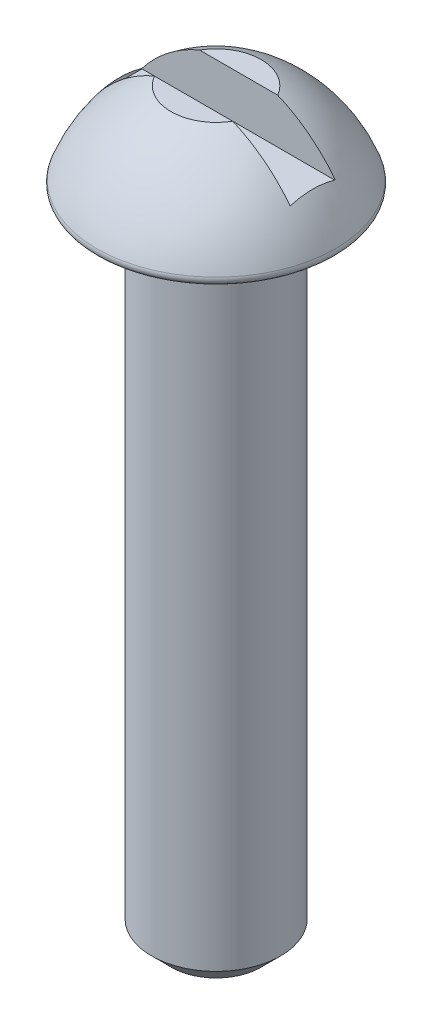
ISO-10303-21;
HEADER;
FILE_DESCRIPTION(('STEP AP214'),'2;1');
FILE_NAME('part.step','',(''),(''),'','','');
FILE_SCHEMA(('AUTOMOTIVE_DESIGN { 1 0 10303 214 1 1 1 1 }'));
ENDSEC;
DATA;
#1=APPLICATION_CONTEXT('core data for automotive mechanical design processes');
#2=APPLICATION_PROTOCOL_DEFINITION('international standard','automotive_design',2000,#1);
#3=PRODUCT_CONTEXT('',#1,'mechanical');
#4=PRODUCT('Part','Part','',(#3));
#5=PRODUCT_RELATED_PRODUCT_CATEGORY('part','',(#4));
#6=PRODUCT_DEFINITION_FORMATION('','',#4);
#7=PRODUCT_DEFINITION_CONTEXT('part definition',#1,'design');
#8=PRODUCT_DEFINITION('design','',#6,#7);
#9=PRODUCT_DEFINITION_SHAPE('','',#8);
#10=(LENGTH_UNIT() NAMED_UNIT(*) SI_UNIT(.MILLI.,.METRE.));
#11=(NAMED_UNIT(*) PLANE_ANGLE_UNIT() SI_UNIT($,.RADIAN.));
#12=(NAMED_UNIT(*) SI_UNIT($,.STERADIAN.) SOLID_ANGLE_UNIT());
#13=UNCERTAINTY_MEASURE_WITH_UNIT(LENGTH_MEASURE(1.E-05),#10,'distance_accuracy_value','');
#14=(GEOMETRIC_REPRESENTATION_CONTEXT(3) GLOBAL_UNCERTAINTY_ASSIGNED_CONTEXT((#13)) GLOBAL_UNIT_ASSIGNED_CONTEXT((#10,
#11,#12)) REPRESENTATION_CONTEXT('',''));
#15=CARTESIAN_POINT('',(0.,0.,0.));
#16=DIRECTION('',(0.,0.,1.));
#17=DIRECTION('',(1.,0.,0.));
#18=AXIS2_PLACEMENT_3D('',#15,#16,#17);
#19=CARTESIAN_POINT('',(0.,11.5,0.));
#20=DIRECTION('',(0.,1.,0.));
#21=DIRECTION('',(0.,0.,1.));
#22=AXIS2_PLACEMENT_3D('',#19,#20,#21);
#23=PLANE('',#22);
#24=DIRECTION('',(-1.,0.,0.));
#25=VECTOR('',#24,1.);
#26=CARTESIAN_POINT('',(-1.5,11.5,-0.35));
#27=LINE('',#26,#25);
#28=CARTESIAN_POINT('',(0.606217782649107,11.5,-0.35));
#29=VERTEX_POINT('',#28);
#30=CARTESIAN_POINT('',(-0.606217782649107,11.5,-0.35));
#31=VERTEX_POINT('',#30);
#32=EDGE_CURVE('E105',#29,#31,#27,.T.);
#33=ORIENTED_EDGE('',*,*,#32,.F.);
#34=CARTESIAN_POINT('',(0.,11.5,0.));
#35=DIRECTION('',(0.,-1.,0.));
#36=DIRECTION('',(0.,0.,-1.));
#37=AXIS2_PLACEMENT_3D('',#34,#35,#36);
#38=CIRCLE('',#37,0.7);
#39=EDGE_CURVE('E128',#31,#29,#38,.T.);
#40=ORIENTED_EDGE('',*,*,#39,.F.);
#41=EDGE_LOOP('',(#33,#40));
#42=FACE_BOUND('',#41,.T.);
#43=ADVANCED_FACE('F29',(#42),#23,.T.);
#44=CARTESIAN_POINT('',(0.7,0.,0.));
#45=DIRECTION('',(0.,-1.,0.));
#46=DIRECTION('',(0.,0.,-1.));
#47=AXIS2_PLACEMENT_3D('',#44,#45,#46);
#48=PLANE('',#47);
#49=CARTESIAN_POINT('',(0.,0.,0.));
#50=DIRECTION('',(0.,-1.,0.));
#51=DIRECTION('',(0.,0.,-1.));
#52=AXIS2_PLACEMENT_3D('',#49,#50,#51);
#53=CIRCLE('',#52,0.7);
#54=CARTESIAN_POINT('',(0.,0.,-0.7));
#55=VERTEX_POINT('',#54);
#56=EDGE_CURVE('E115',#55,#55,#53,.T.);
#57=ORIENTED_EDGE('',*,*,#56,.T.);
#58=EDGE_LOOP('',(#57));
#59=FACE_BOUND('',#58,.T.);
#60=ADVANCED_FACE('F31',(#59),#48,.T.);
#61=DIRECTION('',(1.,0.,0.));
#62=VECTOR('',#61,1.);
#63=CARTESIAN_POINT('',(-1.5,11.5,0.35));
#64=LINE('',#63,#62);
#65=CARTESIAN_POINT('',(-0.606217782649107,11.5,0.35));
#66=VERTEX_POINT('',#65);
#67=CARTESIAN_POINT('',(0.606217782649107,11.5,0.35));
#68=VERTEX_POINT('',#67);
#69=EDGE_CURVE('E107',#66,#68,#64,.T.);
#70=ORIENTED_EDGE('',*,*,#69,.F.);
#71=EDGE_CURVE('E131',#68,#66,#38,.T.);
#72=ORIENTED_EDGE('',*,*,#71,.F.);
#73=EDGE_LOOP('',(#70,#72));
#74=FACE_BOUND('',#73,.T.);
#75=ADVANCED_FACE('F176',(#74),#23,.T.);
#76=CARTESIAN_POINT('',(0.,9.42256290284434,0.));
#77=DIRECTION('',(0.,-1.,0.));
#78=DIRECTION('',(0.,0.,-1.));
#79=AXIS2_PLACEMENT_3D('',#76,#77,#78);
#80=DEGENERATE_TOROIDAL_SURFACE('',#79,0.30700994668161,2.30863897683338,.F.);
#81=CARTESIAN_POINT('',(0.,11.6357397722598,-0.35));
#82=CARTESIAN_POINT('',(-0.0301024352128601,11.6357409907999,-0.35));
#83=CARTESIAN_POINT('',(-0.0602037065858999,11.6345773745603,-0.35));
#84=CARTESIAN_POINT('',(-0.120237464629894,11.6300447670969,-0.35));
#85=CARTESIAN_POINT('',(-0.15016992368712,11.6266754250504,-0.35));
#86=CARTESIAN_POINT('',(-0.239755636779077,11.6136400395453,-0.35));
#87=CARTESIAN_POINT('',(-0.298988945429481,11.6010498286245,-0.35));
#88=CARTESIAN_POINT('',(-0.4107220201702,11.5712488314893,-0.35));
#89=CARTESIAN_POINT('',(-0.463360105723818,11.5545337272663,-0.35));
#90=CARTESIAN_POINT('',(-0.567078580438325,11.5167776839069,-0.35));
#91=CARTESIAN_POINT('',(-0.618158166080245,11.4957345552367,-0.35));
#92=CARTESIAN_POINT('',(-0.768700695331826,11.4266891236243,-0.35));
#93=CARTESIAN_POINT('',(-0.865504105738005,11.3727604560737,-0.35));
#94=CARTESIAN_POINT('',(-1.05381770511512,11.2485525807219,-0.35));
#95=CARTESIAN_POINT('',(-1.14493451427674,11.1776815134193,-0.35));
#96=CARTESIAN_POINT('',(-1.31520585423532,11.0228692332829,-0.35));
#97=CARTESIAN_POINT('',(-1.39436581290115,10.9389339863448,-0.35));
#98=CARTESIAN_POINT('',(-1.5458587899203,10.7515038643497,-0.35));
#99=CARTESIAN_POINT('',(-1.61683638715699,10.6469096000385,-0.35));
#100=CARTESIAN_POINT('',(-1.74048477136378,10.4273513028306,-0.35));
#101=CARTESIAN_POINT('',(-1.79314587012967,10.312381822504,-0.35));
#102=CARTESIAN_POINT('',(-1.87917651162118,10.0739543970035,-0.35));
#103=CARTESIAN_POINT('',(-1.91232042380521,9.95041495071043,-0.35));
#104=CARTESIAN_POINT('',(-1.95744743808432,9.69955872286589,-0.35));
#105=CARTESIAN_POINT('',(-1.9694348144659,9.57224270958615,-0.35));
#106=CARTESIAN_POINT('',(-1.97193309925212,9.31708719715163,-0.35));
#107=CARTESIAN_POINT('',(-1.96239143952019,9.1892471791102,-0.35));
#108=CARTESIAN_POINT('',(-1.92197991496443,8.93692504523293,-0.35));
#109=CARTESIAN_POINT('',(-1.89110056432445,8.8124444484343,-0.35));
#110=CARTESIAN_POINT('',(-1.80884392511569,8.57036655976084,-0.35));
#111=CARTESIAN_POINT('',(-1.75745428138543,8.45277346588935,-0.35));
#112=CARTESIAN_POINT('',(-1.63569213592404,8.22806771696485,-0.35));
#113=CARTESIAN_POINT('',(-1.56534615403697,8.12094070305138,-0.35));
#114=CARTESIAN_POINT('',(-1.40788549136369,7.92042796844041,-0.35));
#115=CARTESIAN_POINT('',(-1.32082850128929,7.82699686840395,-0.35));
#116=CARTESIAN_POINT('',(-1.13169955336796,7.65579882780108,-0.35));
#117=CARTESIAN_POINT('',(-1.02956695382156,7.57809830586138,-0.35));
#118=CARTESIAN_POINT('',(-0.867954840857823,7.47596834442508,-0.35));
#119=CARTESIAN_POINT('',(-0.812867875261867,7.44440520962073,-0.35));
#120=CARTESIAN_POINT('',(-0.700072885190367,7.38623855042426,-0.35));
#121=CARTESIAN_POINT('',(-0.642363567822304,7.35963750621012,-0.35));
#122=CARTESIAN_POINT('',(-0.525137072964047,7.31206247407257,-0.35));
#123=CARTESIAN_POINT('',(-0.465635245674406,7.29105066689571,-0.35));
#124=CARTESIAN_POINT('',(-0.34479697692258,7.25519828705325,-0.35));
#125=CARTESIAN_POINT('',(-0.283462170275168,7.24035238137611,-0.35));
#126=CARTESIAN_POINT('',(-0.182837497701832,7.22267504478291,-0.35));
#127=CARTESIAN_POINT('',(-0.143975000741484,7.21742349587871,-0.35));
#128=CARTESIAN_POINT('',(-0.0659472153998695,7.21060851468356,-0.35));
#129=CARTESIAN_POINT('',(-0.0267822634587782,7.209041449989,-0.35));
#130=CARTESIAN_POINT('',(0.0514996994513464,7.20986014915738,-0.35));
#131=CARTESIAN_POINT('',(0.0906167147447707,7.21224552543082,-0.35));
#132=CARTESIAN_POINT('',(0.168489516968755,7.22057120365083,-0.35));
#133=CARTESIAN_POINT('',(0.207244913460363,7.22651497794714,-0.35));
#134=CARTESIAN_POINT('',(0.297186983275777,7.24385667146756,-0.35));
#135=CARTESIAN_POINT('',(0.348147444927706,7.25641909406697,-0.35));
#136=CARTESIAN_POINT('',(0.448782130756163,7.28585305100436,-0.35));
#137=CARTESIAN_POINT('',(0.49845610619327,7.30272541190968,-0.35));
#138=CARTESIAN_POINT('',(0.645691735122621,7.35920364103099,-0.35));
#139=CARTESIAN_POINT('',(0.741086931735451,7.40458897505198,-0.35));
#140=CARTESIAN_POINT('',(0.926914711477642,7.51006939168425,-0.35));
#141=CARTESIAN_POINT('',(1.01712639940075,7.57054913552739,-0.35));
#142=CARTESIAN_POINT('',(1.18761541773933,7.70377154084975,-0.35));
#143=CARTESIAN_POINT('',(1.26791683452433,7.7764834130205,-0.35));
#144=CARTESIAN_POINT('',(1.42898606712891,7.94492874445312,-0.35));
#145=CARTESIAN_POINT('',(1.50785880157877,8.04248421849531,-0.35));
#146=CARTESIAN_POINT('',(1.64853351430612,8.24939447232945,-0.35));
#147=CARTESIAN_POINT('',(1.71031058090735,8.35876615151073,-0.35));
#148=CARTESIAN_POINT('',(1.81587916059814,8.58809092488977,-0.35));
#149=CARTESIAN_POINT('',(1.85935475794216,8.70818964733825,-0.35));
#150=CARTESIAN_POINT('',(1.92559076522618,8.9539162328496,-0.35));
#151=CARTESIAN_POINT('',(1.94835898429007,9.07954199281432,-0.35));
#152=CARTESIAN_POINT('',(1.97262656380435,9.33332204735554,-0.35));
#153=CARTESIAN_POINT('',(1.97404368969976,9.46148421557371,-0.35));
#154=CARTESIAN_POINT('',(1.95535530532741,9.71625193900725,-0.35));
#155=CARTESIAN_POINT('',(1.9352459718645,9.84285721367133,-0.35));
#156=CARTESIAN_POINT('',(1.8740414996424,10.0909743417433,-0.35));
#157=CARTESIAN_POINT('',(1.83293334362505,10.2124829851089,-0.35));
#158=CARTESIAN_POINT('',(1.73088669666713,10.4468326497111,-0.35));
#159=CARTESIAN_POINT('',(1.66995287582174,10.5596757044672,-0.35));
#160=CARTESIAN_POINT('',(1.53005046998842,10.7733326174854,-0.35));
#161=CARTESIAN_POINT('',(1.45110918047703,10.8741643338103,-0.35));
#162=CARTESIAN_POINT('',(1.27729409761748,11.0610985455507,-0.35));
#163=CARTESIAN_POINT('',(1.18241077455345,11.1471921684167,-0.35));
#164=CARTESIAN_POINT('',(0.979876940738835,11.3015005372263,-0.35));
#165=CARTESIAN_POINT('',(0.872308436433898,11.3698218606841,-0.35));
#166=CARTESIAN_POINT('',(0.703337919829301,11.4573215356916,-0.35));
#167=CARTESIAN_POINT('',(0.645714301815417,11.4840005557108,-0.35));
#168=CARTESIAN_POINT('',(0.528241861947788,11.5319241605888,-0.35));
#169=CARTESIAN_POINT('',(0.468394366795809,11.5531719278043,-0.35));
#170=CARTESIAN_POINT('',(0.374465982094129,11.5811684898228,-0.35));
#171=CARTESIAN_POINT('',(0.341030799034514,11.5901189334694,-0.35));
#172=CARTESIAN_POINT('',(0.273662343838696,11.6059109291983,-0.35));
#173=CARTESIAN_POINT('',(0.23972914719522,11.6127527975251,-0.35));
#174=CARTESIAN_POINT('',(0.171615827365621,11.6239521890918,-0.35));
#175=CARTESIAN_POINT('',(0.137437694740273,11.6283215785176,-0.35));
#176=CARTESIAN_POINT('',(0.068839138506105,11.6342141511404,-0.35));
#177=CARTESIAN_POINT('',(0.0344188084861335,11.6357383789939,-0.35));
#178=CARTESIAN_POINT('',(0.,11.6357397722598,-0.35));
#179=B_SPLINE_CURVE_WITH_KNOTS('',3,(#81,#82,#83,#84,#85,#86,#87,#88,#89,#90,#91,#92,#93,#94,
#95,#96,#97,#98,#99,#100,#101,#102,#103,#104,#105,#106,#107,#108,#109,#110,#111,#112,#113,#114,
#115,#116,#117,#118,#119,#120,#121,#122,#123,#124,#125,#126,#127,#128,#129,#130,#131,#132,#133,
#134,#135,#136,#137,#138,#139,#140,#141,#142,#143,#144,#145,#146,#147,#148,#149,#150,#151,#152,
#153,#154,#155,#156,#157,#158,#159,#160,#161,#162,#163,#164,#165,#166,#167,#168,#169,#170,#171,
#172,#173,#174,#175,#176,#177,#178),.UNSPECIFIED.,.T.,.F.,(4,2,2,2,2,2,2,2,2,2,2,2,2,2,2,2,2,2,
2,2,2,2,2,2,2,2,2,2,2,2,2,2,2,2,2,2,2,2,2,2,2,2,2,2,2,2,2,2,4),(0.,0.0902833208739151,
0.180581004879809,0.361796063276472,0.527288087985619,0.692864041427401,1.02390289255829,
1.36885285309954,1.71364574828677,2.0910746667025,2.46870291729688,2.85061517384456,
3.23245026325272,3.61521870029256,3.99815740922052,4.38132714497277,4.76396358598733,
5.14530208186301,5.52821856826565,5.71848612033824,5.90884851959201,6.09788804105489,
6.28676371623324,6.40427084256284,6.5216620740792,6.63904179450269,6.75653624332486,
6.91374732931968,7.07098858819111,7.38662454837917,7.71131599850878,8.0352020769111,
8.40979352951631,8.78492799356518,9.16629591030332,9.54751994664993,9.93021190828653,
10.3129718490002,10.6959693526722,11.0788767034316,11.4612074604209,11.8437675828505,
12.2239777193922,12.4142717245481,12.6044539730276,12.708238810703,12.812008075123,
12.9152750005792,13.0185040021094),.UNSPECIFIED.);
#180=CARTESIAN_POINT('',(1.5,10.8072248752532,-0.35));
#181=VERTEX_POINT('',#180);
#182=EDGE_CURVE('E11',#181,#29,#179,.T.);
#183=ORIENTED_EDGE('',*,*,#182,.F.);
#184=CARTESIAN_POINT('',(1.5,10.859409790285,0.));
#185=CARTESIAN_POINT('',(1.5,10.859401175273,-0.0789068754106214));
#186=CARTESIAN_POINT('',(1.5,10.8515155932438,-0.157939355680735));
#187=CARTESIAN_POINT('',(1.5,10.8204761977011,-0.313038755257548));
#188=CARTESIAN_POINT('',(1.5,10.7972888784922,-0.389098777871058));
#189=CARTESIAN_POINT('',(1.5,10.7412685980686,-0.525400075486102));
#190=CARTESIAN_POINT('',(1.5,10.7102017645297,-0.586377951264507));
#191=CARTESIAN_POINT('',(1.5,10.6390362707288,-0.702733899656246));
#192=CARTESIAN_POINT('',(1.5,10.5989435520028,-0.758115621500189));
#193=CARTESIAN_POINT('',(1.5,10.5074121561563,-0.866522430703715));
#194=CARTESIAN_POINT('',(1.5,10.455317444329,-0.918993130106391));
#195=CARTESIAN_POINT('',(1.5,10.3436355443957,-1.01525351273952));
#196=CARTESIAN_POINT('',(1.5,10.2840445327647,-1.0590387363215));
#197=CARTESIAN_POINT('',(1.5,10.1539021441734,-1.14030196999279));
#198=CARTESIAN_POINT('',(1.5,10.0828543819259,-1.17698613895365));
#199=CARTESIAN_POINT('',(1.5,9.93583340388057,-1.23859568647142));
#200=CARTESIAN_POINT('',(1.5,9.85985891849232,-1.26351802025982));
#201=CARTESIAN_POINT('',(1.5,9.70081830526798,-1.30213580286138));
#202=CARTESIAN_POINT('',(1.5,9.61758981678659,-1.31516501550607));
#203=CARTESIAN_POINT('',(1.5,9.45011896880228,-1.3273951363592));
#204=CARTESIAN_POINT('',(1.5,9.36587645289109,-1.32659388325657));
#205=CARTESIAN_POINT('',(1.5,9.19682801634196,-1.31100598337756));
#206=CARTESIAN_POINT('',(1.5,9.11204997514758,-1.29591427001923));
#207=CARTESIAN_POINT('',(1.5,8.94625150305734,-1.25161746552035));
#208=CARTESIAN_POINT('',(1.5,8.86523125169323,-1.22241170082808));
#209=CARTESIAN_POINT('',(1.5,8.70995516153703,-1.150774844073));
#210=CARTESIAN_POINT('',(1.5,8.63565492875653,-1.10844022107787));
#211=CARTESIAN_POINT('',(1.5,8.49558375099919,-1.01140940009124));
#212=CARTESIAN_POINT('',(1.5,8.42981224200647,-0.956714020189879));
#213=CARTESIAN_POINT('',(1.5,8.31167933387313,-0.838692716318822));
#214=CARTESIAN_POINT('',(1.5,8.25888683590651,-0.775799413158824));
#215=CARTESIAN_POINT('',(1.5,8.16566156087609,-0.641422049268792));
#216=CARTESIAN_POINT('',(1.5,8.12522165984964,-0.569942973374794));
#217=CARTESIAN_POINT('',(1.5,8.06138813678361,-0.426353683253212));
#218=CARTESIAN_POINT('',(1.5,8.03691319574603,-0.354725107969685));
#219=CARTESIAN_POINT('',(1.5,8.00162295621348,-0.208191871208454));
#220=CARTESIAN_POINT('',(1.5,7.99079712574264,-0.133289781886585));
#221=CARTESIAN_POINT('',(1.5,7.98377588161359,0.0107388735101599));
#222=CARTESIAN_POINT('',(1.5,7.98640653657512,0.0798104971340135));
#223=CARTESIAN_POINT('',(1.5,8.00347672130369,0.216470996634306));
#224=CARTESIAN_POINT('',(1.5,8.01791568636424,0.284059943257802));
#225=CARTESIAN_POINT('',(1.5,8.05749241124266,0.414640873488694));
#226=CARTESIAN_POINT('',(1.5,8.08242841962748,0.477694559269938));
#227=CARTESIAN_POINT('',(1.5,8.14190646463359,0.599082826856921));
#228=CARTESIAN_POINT('',(1.5,8.17645064857673,0.657416349991642));
#229=CARTESIAN_POINT('',(1.5,8.25641623215448,0.77173089633452));
#230=CARTESIAN_POINT('',(1.5,8.30239121683484,0.827324040488962));
#231=CARTESIAN_POINT('',(1.5,8.40235044439788,0.930760533294298));
#232=CARTESIAN_POINT('',(1.5,8.45633736099184,0.978601283653914));
#233=CARTESIAN_POINT('',(1.5,8.57570828307641,1.06939508415863));
#234=CARTESIAN_POINT('',(1.5,8.64167076459879,1.11158832366889));
#235=CARTESIAN_POINT('',(1.5,8.7794148818912,1.18506079377902));
#236=CARTESIAN_POINT('',(1.5,8.85119826886297,1.21633672481574));
#237=CARTESIAN_POINT('',(1.5,9.00335258097233,1.26899663114905));
#238=CARTESIAN_POINT('',(1.5,9.08397986859716,1.28964184313034));
#239=CARTESIAN_POINT('',(1.5,9.24752120906563,1.31755133411357));
#240=CARTESIAN_POINT('',(1.5,9.33043571747581,1.32481292755937));
#241=CARTESIAN_POINT('',(1.5,9.49890222534467,1.32582180677956));
#242=CARTESIAN_POINT('',(1.5,9.58445709214885,1.31914760109607));
#243=CARTESIAN_POINT('',(1.5,9.75324879008596,1.29156086022552));
#244=CARTESIAN_POINT('',(1.5,9.83648545543133,1.27064730941109));
#245=CARTESIAN_POINT('',(1.5,9.99834081092673,1.21498289879362));
#246=CARTESIAN_POINT('',(1.5,10.076952841605,1.18021261924573));
#247=CARTESIAN_POINT('',(1.5,10.2269934004609,1.0975858409938));
#248=CARTESIAN_POINT('',(1.5,10.2984223695152,1.04973014610787));
#249=CARTESIAN_POINT('',(1.5,10.4296416280782,0.94364251517085));
#250=CARTESIAN_POINT('',(1.5,10.4897146739633,0.885761135218329));
#251=CARTESIAN_POINT('',(1.5,10.5984780294607,0.760072949089758));
#252=CARTESIAN_POINT('',(1.5,10.6471684303964,0.692266222552297));
#253=CARTESIAN_POINT('',(1.5,10.7280568286081,0.553432250655614));
#254=CARTESIAN_POINT('',(1.5,10.7611359171834,0.482918622067336));
#255=CARTESIAN_POINT('',(1.5,10.813567002273,0.337071846172546));
#256=CARTESIAN_POINT('',(1.5,10.8329571176487,0.261752724145797));
#257=CARTESIAN_POINT('',(1.5,10.8497494289462,0.154725705431188));
#258=CARTESIAN_POINT('',(1.5,10.8533656944076,0.123900430957695));
#259=CARTESIAN_POINT('',(1.5,10.8581978100163,0.0620566073563592));
#260=CARTESIAN_POINT('',(1.5,10.8594131790002,0.0310380207361029));
#261=CARTESIAN_POINT('',(1.5,10.859409790285,0.));
#262=B_SPLINE_CURVE_WITH_KNOTS('',3,(#184,#185,#186,#187,#188,#189,#190,#191,#192,#193,#194,
#195,#196,#197,#198,#199,#200,#201,#202,#203,#204,#205,#206,#207,#208,#209,#210,#211,#212,#213,
#214,#215,#216,#217,#218,#219,#220,#221,#222,#223,#224,#225,#226,#227,#228,#229,#230,#231,#232,
#233,#234,#235,#236,#237,#238,#239,#240,#241,#242,#243,#244,#245,#246,#247,#248,#249,#250,#251,
#252,#253,#254,#255,#256,#257,#258,#259,#260,#261),.UNSPECIFIED.,.T.,.F.,(4,2,2,2,2,2,2,2,2,2,2,
2,2,2,2,2,2,2,2,2,2,2,2,2,2,2,2,2,2,2,2,2,2,2,2,2,2,2,4),(0.,0.236563815135407,
0.473647352479771,0.678110204009466,0.88243885379862,1.10332066880809,1.3243156059889,
1.56313984676287,1.80202587774178,2.05359361128751,2.30520065811888,2.56230294299699,
2.81941749853965,3.07468586624047,3.32993734408486,3.57498099157582,3.81988305004128,
4.0457341253292,4.27141082172622,4.47775382877256,4.68408696849498,4.88662348376049,
5.08920530013658,5.30471899964984,5.52030478197372,5.75419393440537,5.98815371461099,
6.2367079092848,6.48531197340129,6.74154387684007,6.99779405804366,7.25440463544737,
7.51099945317496,7.75997013017131,8.00893880959641,8.24135933298586,8.4731300684619,
8.56616380602813,8.65921618658908),.UNSPECIFIED.);
#263=CARTESIAN_POINT('',(1.5,10.8072248752686,0.35));
#264=VERTEX_POINT('',#263);
#265=EDGE_CURVE('E33',#264,#181,#262,.T.);
#266=ORIENTED_EDGE('',*,*,#265,.F.);
#267=CARTESIAN_POINT('',(0.,11.6357397722598,0.35));
#268=CARTESIAN_POINT('',(0.0301024352128601,11.6357409907999,0.35));
#269=CARTESIAN_POINT('',(0.0602037065858999,11.6345773745603,0.35));
#270=CARTESIAN_POINT('',(0.120237464629894,11.6300447670969,0.35));
#271=CARTESIAN_POINT('',(0.15016992368712,11.6266754250504,0.35));
#272=CARTESIAN_POINT('',(0.239755636779077,11.6136400395453,0.35));
#273=CARTESIAN_POINT('',(0.29898894542948,11.6010498286245,0.35));
#274=CARTESIAN_POINT('',(0.4107220201702,11.5712488314893,0.35));
#275=CARTESIAN_POINT('',(0.463360105723818,11.5545337272663,0.35));
#276=CARTESIAN_POINT('',(0.567078580438325,11.5167776839069,0.35));
#277=CARTESIAN_POINT('',(0.618158166080245,11.4957345552367,0.35));
#278=CARTESIAN_POINT('',(0.768700695331826,11.4266891236243,0.35));
#279=CARTESIAN_POINT('',(0.865504105738005,11.3727604560737,0.35));
#280=CARTESIAN_POINT('',(1.05381770511512,11.2485525807219,0.35));
#281=CARTESIAN_POINT('',(1.14493451427674,11.1776815134193,0.35));
#282=CARTESIAN_POINT('',(1.31520585423532,11.0228692332829,0.35));
#283=CARTESIAN_POINT('',(1.39436581290115,10.9389339863448,0.35));
#284=CARTESIAN_POINT('',(1.5458587899203,10.7515038643497,0.35));
#285=CARTESIAN_POINT('',(1.61683638715699,10.6469096000385,0.35));
#286=CARTESIAN_POINT('',(1.74048477136378,10.4273513028306,0.35));
#287=CARTESIAN_POINT('',(1.79314587012967,10.312381822504,0.35));
#288=CARTESIAN_POINT('',(1.87917651162118,10.0739543970035,0.35));
#289=CARTESIAN_POINT('',(1.91232042380521,9.95041495071043,0.35));
#290=CARTESIAN_POINT('',(1.95744743808432,9.69955872286589,0.35));
#291=CARTESIAN_POINT('',(1.9694348144659,9.57224270958615,0.35));
#292=CARTESIAN_POINT('',(1.97193309925212,9.31708719715163,0.35));
#293=CARTESIAN_POINT('',(1.96239143952019,9.1892471791102,0.35));
#294=CARTESIAN_POINT('',(1.92197991496443,8.93692504523293,0.35));
#295=CARTESIAN_POINT('',(1.89110056432445,8.8124444484343,0.35));
#296=CARTESIAN_POINT('',(1.80884392511569,8.57036655976084,0.35));
#297=CARTESIAN_POINT('',(1.75745428138543,8.45277346588935,0.35));
#298=CARTESIAN_POINT('',(1.63569213592404,8.22806771696485,0.35));
#299=CARTESIAN_POINT('',(1.56534615403697,8.12094070305138,0.35));
#300=CARTESIAN_POINT('',(1.40788549136369,7.92042796844041,0.35));
#301=CARTESIAN_POINT('',(1.32082850128929,7.82699686840395,0.35));
#302=CARTESIAN_POINT('',(1.13169955336796,7.65579882780108,0.35));
#303=CARTESIAN_POINT('',(1.02956695382156,7.57809830586138,0.35));
#304=CARTESIAN_POINT('',(0.867954840857823,7.47596834442508,0.35));
#305=CARTESIAN_POINT('',(0.812867875261867,7.44440520962073,0.35));
#306=CARTESIAN_POINT('',(0.700072885190367,7.38623855042426,0.35));
#307=CARTESIAN_POINT('',(0.642363567822303,7.35963750621012,0.35));
#308=CARTESIAN_POINT('',(0.525137072964046,7.31206247407257,0.35));
#309=CARTESIAN_POINT('',(0.465635245674405,7.29105066689571,0.35));
#310=CARTESIAN_POINT('',(0.34479697692258,7.25519828705325,0.35));
#311=CARTESIAN_POINT('',(0.283462170275168,7.24035238137611,0.35));
#312=CARTESIAN_POINT('',(0.182837497701832,7.22267504478291,0.35));
#313=CARTESIAN_POINT('',(0.143975000741484,7.21742349587871,0.35));
#314=CARTESIAN_POINT('',(0.0659472153998699,7.21060851468356,0.35));
#315=CARTESIAN_POINT('',(0.0267822634587785,7.209041449989,0.35));
#316=CARTESIAN_POINT('',(-0.0514996994513461,7.20986014915738,0.35));
#317=CARTESIAN_POINT('',(-0.0906167147447703,7.21224552543082,0.35));
#318=CARTESIAN_POINT('',(-0.168489516968755,7.22057120365083,0.35));
#319=CARTESIAN_POINT('',(-0.207244913460363,7.22651497794714,0.35));
#320=CARTESIAN_POINT('',(-0.297186983275776,7.24385667146756,0.35));
#321=CARTESIAN_POINT('',(-0.348147444927706,7.25641909406697,0.35));
#322=CARTESIAN_POINT('',(-0.448782130756163,7.28585305100436,0.35));
#323=CARTESIAN_POINT('',(-0.49845610619327,7.30272541190968,0.35));
#324=CARTESIAN_POINT('',(-0.64569173512262,7.35920364103099,0.35));
#325=CARTESIAN_POINT('',(-0.74108693173545,7.40458897505198,0.35));
#326=CARTESIAN_POINT('',(-0.926914711477641,7.51006939168425,0.35));
#327=CARTESIAN_POINT('',(-1.01712639940075,7.57054913552739,0.35));
#328=CARTESIAN_POINT('',(-1.18761541773933,7.70377154084975,0.35));
#329=CARTESIAN_POINT('',(-1.26791683452433,7.7764834130205,0.35));
#330=CARTESIAN_POINT('',(-1.42898606712891,7.94492874445312,0.35));
#331=CARTESIAN_POINT('',(-1.50785880157877,8.04248421849531,0.35));
#332=CARTESIAN_POINT('',(-1.64853351430612,8.24939447232945,0.35));
#333=CARTESIAN_POINT('',(-1.71031058090735,8.35876615151072,0.35));
#334=CARTESIAN_POINT('',(-1.81587916059814,8.58809092488976,0.35));
#335=CARTESIAN_POINT('',(-1.85935475794216,8.70818964733824,0.35));
#336=CARTESIAN_POINT('',(-1.92559076522618,8.9539162328496,0.35));
#337=CARTESIAN_POINT('',(-1.94835898429007,9.07954199281432,0.35));
#338=CARTESIAN_POINT('',(-1.97262656380435,9.33332204735554,0.35));
#339=CARTESIAN_POINT('',(-1.97404368969976,9.46148421557371,0.35));
#340=CARTESIAN_POINT('',(-1.95535530532741,9.71625193900725,0.35));
#341=CARTESIAN_POINT('',(-1.9352459718645,9.84285721367133,0.35));
#342=CARTESIAN_POINT('',(-1.8740414996424,10.0909743417433,0.35));
#343=CARTESIAN_POINT('',(-1.83293334362506,10.2124829851089,0.35));
#344=CARTESIAN_POINT('',(-1.73088669666713,10.4468326497111,0.35));
#345=CARTESIAN_POINT('',(-1.66995287582174,10.5596757044672,0.35));
#346=CARTESIAN_POINT('',(-1.53005046998842,10.7733326174854,0.35));
#347=CARTESIAN_POINT('',(-1.45110918047703,10.8741643338103,0.35));
#348=CARTESIAN_POINT('',(-1.27729409761748,11.0610985455507,0.35));
#349=CARTESIAN_POINT('',(-1.18241077455345,11.1471921684167,0.35));
#350=CARTESIAN_POINT('',(-0.979876940738835,11.3015005372263,0.35));
#351=CARTESIAN_POINT('',(-0.872308436433898,11.3698218606841,0.35));
#352=CARTESIAN_POINT('',(-0.703337919829299,11.4573215356916,0.35));
#353=CARTESIAN_POINT('',(-0.645714301815415,11.4840005557108,0.35));
#354=CARTESIAN_POINT('',(-0.528241861947786,11.5319241605888,0.35));
#355=CARTESIAN_POINT('',(-0.468394366795808,11.5531719278043,0.35));
#356=CARTESIAN_POINT('',(-0.374465982094129,11.5811684898228,0.35));
#357=CARTESIAN_POINT('',(-0.341030799034514,11.5901189334694,0.35));
#358=CARTESIAN_POINT('',(-0.273662343838695,11.6059109291983,0.35));
#359=CARTESIAN_POINT('',(-0.239729147195219,11.6127527975251,0.35));
#360=CARTESIAN_POINT('',(-0.17161582736562,11.6239521890918,0.35));
#361=CARTESIAN_POINT('',(-0.137437694740273,11.6283215785176,0.35));
#362=CARTESIAN_POINT('',(-0.0688391385061048,11.6342141511404,0.35));
#363=CARTESIAN_POINT('',(-0.0344188084861334,11.6357383789939,0.35));
#364=CARTESIAN_POINT('',(0.,11.6357397722598,0.35));
#365=B_SPLINE_CURVE_WITH_KNOTS('',3,(#267,#268,#269,#270,#271,#272,#273,#274,#275,#276,#277,
#278,#279,#280,#281,#282,#283,#284,#285,#286,#287,#288,#289,#290,#291,#292,#293,#294,#295,#296,
#297,#298,#299,#300,#301,#302,#303,#304,#305,#306,#307,#308,#309,#310,#311,#312,#313,#314,#315,
#316,#317,#318,#319,#320,#321,#322,#323,#324,#325,#326,#327,#328,#329,#330,#331,#332,#333,#334,
#335,#336,#337,#338,#339,#340,#341,#342,#343,#344,#345,#346,#347,#348,#349,#350,#351,#352,#353,
#354,#355,#356,#357,#358,#359,#360,#361,#362,#363,#364),.UNSPECIFIED.,.T.,.F.,(4,2,2,2,2,2,2,2,
2,2,2,2,2,2,2,2,2,2,2,2,2,2,2,2,2,2,2,2,2,2,2,2,2,2,2,2,2,2,2,2,2,2,2,2,2,2,2,2,4),(0.,
0.0902833208739151,0.180581004879809,0.361796063276472,0.527288087985619,0.692864041427402,
1.02390289255828,1.36885285309954,1.71364574828677,2.0910746667025,2.46870291729688,
2.85061517384456,3.23245026325272,3.61521870029255,3.99815740922052,4.38132714497276,
4.76396358598733,5.145302081863,5.52821856826565,5.71848612033824,5.90884851959201,
6.09788804105489,6.28676371623324,6.40427084256284,6.5216620740792,6.63904179450269,
6.75653624332486,6.91374732931968,7.07098858819111,7.38662454837917,7.71131599850878,
8.0352020769111,8.40979352951631,8.78492799356518,9.16629591030332,9.54751994664993,
9.93021190828653,10.3129718490002,10.6959693526722,11.0788767034316,11.4612074604209,
11.8437675828505,12.2239777193922,12.4142717245481,12.6044539730276,12.708238810703,
12.812008075123,12.9152750005792,13.0185040021094),.UNSPECIFIED.);
#366=EDGE_CURVE('E143',#68,#264,#365,.T.);
#367=ORIENTED_EDGE('',*,*,#366,.F.);
#368=ORIENTED_EDGE('',*,*,#71,.T.);
#369=CARTESIAN_POINT('',(-1.50000000000003,10.8072248752531,0.35));
#370=VERTEX_POINT('',#369);
#371=EDGE_CURVE('E138',#370,#66,#365,.T.);
#372=ORIENTED_EDGE('',*,*,#371,.F.);
#373=CARTESIAN_POINT('',(-1.5,10.859409790285,0.));
#374=CARTESIAN_POINT('',(-1.5,10.859401175273,0.0789068754106213));
#375=CARTESIAN_POINT('',(-1.5,10.8515155932438,0.157939355680734));
#376=CARTESIAN_POINT('',(-1.5,10.8204761977011,0.313038755257547));
#377=CARTESIAN_POINT('',(-1.5,10.7972888784922,0.389098777871057));
#378=CARTESIAN_POINT('',(-1.5,10.7412685980686,0.525400075486102));
#379=CARTESIAN_POINT('',(-1.5,10.7102017645297,0.586377951264507));
#380=CARTESIAN_POINT('',(-1.5,10.6390362707288,0.702733899656246));
#381=CARTESIAN_POINT('',(-1.5,10.5989435520028,0.758115621500189));
#382=CARTESIAN_POINT('',(-1.5,10.5074121561563,0.866522430703715));
#383=CARTESIAN_POINT('',(-1.5,10.455317444329,0.918993130106391));
#384=CARTESIAN_POINT('',(-1.5,10.3436355443957,1.01525351273952));
#385=CARTESIAN_POINT('',(-1.5,10.2840445327647,1.0590387363215));
#386=CARTESIAN_POINT('',(-1.5,10.1539021441734,1.14030196999279));
#387=CARTESIAN_POINT('',(-1.5,10.0828543819259,1.17698613895365));
#388=CARTESIAN_POINT('',(-1.5,9.93583340388057,1.23859568647142));
#389=CARTESIAN_POINT('',(-1.5,9.85985891849232,1.26351802025982));
#390=CARTESIAN_POINT('',(-1.5,9.70081830526798,1.30213580286138));
#391=CARTESIAN_POINT('',(-1.5,9.61758981678659,1.31516501550607));
#392=CARTESIAN_POINT('',(-1.5,9.45011896880228,1.3273951363592));
#393=CARTESIAN_POINT('',(-1.5,9.36587645289109,1.32659388325657));
#394=CARTESIAN_POINT('',(-1.5,9.19682801634196,1.31100598337756));
#395=CARTESIAN_POINT('',(-1.5,9.11204997514758,1.29591427001923));
#396=CARTESIAN_POINT('',(-1.5,8.94625150305734,1.25161746552035));
#397=CARTESIAN_POINT('',(-1.5,8.86523125169323,1.22241170082808));
#398=CARTESIAN_POINT('',(-1.5,8.70995516153703,1.150774844073));
#399=CARTESIAN_POINT('',(-1.5,8.63565492875653,1.10844022107787));
#400=CARTESIAN_POINT('',(-1.5,8.49558375099919,1.01140940009124));
#401=CARTESIAN_POINT('',(-1.5,8.42981224200647,0.95671402018988));
#402=CARTESIAN_POINT('',(-1.5,8.31167933387313,0.838692716318823));
#403=CARTESIAN_POINT('',(-1.5,8.25888683590651,0.775799413158826));
#404=CARTESIAN_POINT('',(-1.5,8.16566156087609,0.641422049268794));
#405=CARTESIAN_POINT('',(-1.5,8.12522165984964,0.569942973374795));
#406=CARTESIAN_POINT('',(-1.5,8.06138813678362,0.426353683253213));
#407=CARTESIAN_POINT('',(-1.5,8.03691319574603,0.354725107969686));
#408=CARTESIAN_POINT('',(-1.5,8.00162295621348,0.208191871208455));
#409=CARTESIAN_POINT('',(-1.5,7.99079712574264,0.133289781886586));
#410=CARTESIAN_POINT('',(-1.5,7.98377588161359,-0.0107388735101598));
#411=CARTESIAN_POINT('',(-1.5,7.98640653657512,-0.0798104971340134));
#412=CARTESIAN_POINT('',(-1.5,8.00347672130369,-0.216470996634306));
#413=CARTESIAN_POINT('',(-1.5,8.01791568636424,-0.284059943257802));
#414=CARTESIAN_POINT('',(-1.5,8.05749241124266,-0.414640873488694));
#415=CARTESIAN_POINT('',(-1.5,8.08242841962748,-0.477694559269937));
#416=CARTESIAN_POINT('',(-1.5,8.14190646463359,-0.599082826856921));
#417=CARTESIAN_POINT('',(-1.5,8.17645064857673,-0.657416349991642));
#418=CARTESIAN_POINT('',(-1.5,8.25641623215448,-0.771730896334519));
#419=CARTESIAN_POINT('',(-1.5,8.30239121683484,-0.827324040488962));
#420=CARTESIAN_POINT('',(-1.5,8.40235044439788,-0.930760533294298));
#421=CARTESIAN_POINT('',(-1.5,8.45633736099184,-0.978601283653914));
#422=CARTESIAN_POINT('',(-1.5,8.57570828307641,-1.06939508415863));
#423=CARTESIAN_POINT('',(-1.5,8.64167076459879,-1.11158832366888));
#424=CARTESIAN_POINT('',(-1.5,8.7794148818912,-1.18506079377902));
#425=CARTESIAN_POINT('',(-1.5,8.85119826886297,-1.21633672481574));
#426=CARTESIAN_POINT('',(-1.5,9.00335258097233,-1.26899663114905));
#427=CARTESIAN_POINT('',(-1.5,9.08397986859716,-1.28964184313034));
#428=CARTESIAN_POINT('',(-1.5,9.24752120906563,-1.31755133411357));
#429=CARTESIAN_POINT('',(-1.5,9.33043571747581,-1.32481292755937));
#430=CARTESIAN_POINT('',(-1.5,9.49890222534467,-1.32582180677956));
#431=CARTESIAN_POINT('',(-1.5,9.58445709214885,-1.31914760109607));
#432=CARTESIAN_POINT('',(-1.5,9.75324879008596,-1.29156086022552));
#433=CARTESIAN_POINT('',(-1.5,9.83648545543133,-1.27064730941109));
#434=CARTESIAN_POINT('',(-1.5,9.99834081092673,-1.21498289879362));
#435=CARTESIAN_POINT('',(-1.5,10.076952841605,-1.18021261924573));
#436=CARTESIAN_POINT('',(-1.5,10.2269934004609,-1.0975858409938));
#437=CARTESIAN_POINT('',(-1.5,10.2984223695152,-1.04973014610787));
#438=CARTESIAN_POINT('',(-1.5,10.4296416280782,-0.943642515170849));
#439=CARTESIAN_POINT('',(-1.5,10.4897146739633,-0.885761135218329));
#440=CARTESIAN_POINT('',(-1.5,10.5984780294607,-0.760072949089757));
#441=CARTESIAN_POINT('',(-1.5,10.6471684303964,-0.692266222552296));
#442=CARTESIAN_POINT('',(-1.5,10.7280568286081,-0.553432250655613));
#443=CARTESIAN_POINT('',(-1.5,10.7611359171834,-0.482918622067334));
#444=CARTESIAN_POINT('',(-1.5,10.813567002273,-0.337071846172543));
#445=CARTESIAN_POINT('',(-1.5,10.8329571176487,-0.261752724145795));
#446=CARTESIAN_POINT('',(-1.5,10.8497494289462,-0.154725705431187));
#447=CARTESIAN_POINT('',(-1.5,10.8533656944076,-0.123900430957694));
#448=CARTESIAN_POINT('',(-1.5,10.8581978100163,-0.062056607356359));
#449=CARTESIAN_POINT('',(-1.5,10.8594131790002,-0.0310380207361028));
#450=CARTESIAN_POINT('',(-1.5,10.859409790285,0.));
#451=B_SPLINE_CURVE_WITH_KNOTS('',3,(#373,#374,#375,#376,#377,#378,#379,#380,#381,#382,#383,
#384,#385,#386,#387,#388,#389,#390,#391,#392,#393,#394,#395,#396,#397,#398,#399,#400,#401,#402,
#403,#404,#405,#406,#407,#408,#409,#410,#411,#412,#413,#414,#415,#416,#417,#418,#419,#420,#421,
#422,#423,#424,#425,#426,#427,#428,#429,#430,#431,#432,#433,#434,#435,#436,#437,#438,#439,#440,
#441,#442,#443,#444,#445,#446,#447,#448,#449,#450),.UNSPECIFIED.,.T.,.F.,(4,2,2,2,2,2,2,2,2,2,2,
2,2,2,2,2,2,2,2,2,2,2,2,2,2,2,2,2,2,2,2,2,2,2,2,2,2,2,4),(0.,0.236563815135406,
0.473647352479771,0.678110204009466,0.88243885379862,1.10332066880809,1.3243156059889,
1.56313984676287,1.80202587774178,2.05359361128751,2.30520065811888,2.56230294299699,
2.81941749853965,3.07468586624047,3.32993734408485,3.57498099157581,3.81988305004128,
4.0457341253292,4.27141082172622,4.47775382877256,4.68408696849498,4.88662348376049,
5.08920530013658,5.30471899964984,5.52030478197372,5.75419393440537,5.98815371461099,
6.2367079092848,6.48531197340128,6.74154387684007,6.99779405804366,7.25440463544737,
7.51099945317496,7.7599701301713,8.0089388095964,8.24135933298586,8.4731300684619,
8.56616380602813,8.65921618658908),.UNSPECIFIED.);
#452=CARTESIAN_POINT('',(-1.5,10.8072248752686,-0.35));
#453=VERTEX_POINT('',#452);
#454=EDGE_CURVE('E89',#453,#370,#451,.T.);
#455=ORIENTED_EDGE('',*,*,#454,.F.);
#456=EDGE_CURVE('E42',#31,#453,#179,.T.);
#457=ORIENTED_EDGE('',*,*,#456,.F.);
#458=ORIENTED_EDGE('',*,*,#39,.T.);
#459=EDGE_LOOP('',(#183,#266,#367,#368,#372,#455,#457,#458));
#460=FACE_BOUND('',#459,.T.);
#461=CARTESIAN_POINT('',(0.,10.235199826921,0.));
#462=DIRECTION('',(0.,-1.,0.));
#463=DIRECTION('',(0.,0.,-1.));
#464=AXIS2_PLACEMENT_3D('',#461,#462,#463);
#465=CIRCLE('',#464,1.85387763831244);
#466=CARTESIAN_POINT('',(0.,10.235199826921,-1.85387763831244));
#467=VERTEX_POINT('',#466);
#468=EDGE_CURVE('E135',#467,#467,#465,.F.);
#469=ORIENTED_EDGE('',*,*,#468,.T.);
#470=EDGE_LOOP('',(#469));
#471=FACE_BOUND('',#470,.T.);
#472=ADVANCED_FACE('F147',(#460,#471),#80,.F.);
#473=CARTESIAN_POINT('',(1.9,10.1,0.));
#474=DIRECTION('',(0.,-1.,0.));
#475=DIRECTION('',(0.,0.,-1.));
#476=AXIS2_PLACEMENT_3D('',#473,#474,#475);
#477=PLANE('',#476);
#478=CARTESIAN_POINT('',(0.,10.1,0.));
#479=DIRECTION('',(0.,-1.,0.));
#480=DIRECTION('',(0.,0.,-1.));
#481=AXIS2_PLACEMENT_3D('',#478,#479,#480);
#482=CIRCLE('',#481,1.7602775732231);
#483=CARTESIAN_POINT('',(0.,10.1,-1.7602775732231));
#484=VERTEX_POINT('',#483);
#485=EDGE_CURVE('E132',#484,#484,#482,.T.);
#486=ORIENTED_EDGE('',*,*,#485,.T.);
#487=EDGE_LOOP('',(#486));
#488=FACE_BOUND('',#487,.T.);
#489=CARTESIAN_POINT('',(0.,10.1,0.));
#490=DIRECTION('',(0.,-1.,0.));
#491=DIRECTION('',(0.,0.,-1.));
#492=AXIS2_PLACEMENT_3D('',#489,#490,#491);
#493=CIRCLE('',#492,1.);
#494=CARTESIAN_POINT('',(0.,10.1,-1.));
#495=VERTEX_POINT('',#494);
#496=EDGE_CURVE('E125',#495,#495,#493,.T.);
#497=ORIENTED_EDGE('',*,*,#496,.F.);
#498=EDGE_LOOP('',(#497));
#499=FACE_BOUND('',#498,.T.);
#500=ADVANCED_FACE('F169',(#488,#499),#477,.T.);
#501=CARTESIAN_POINT('',(0.,0.,0.));
#502=DIRECTION('',(0.,-1.,0.));
#503=DIRECTION('',(0.,0.,-1.));
#504=AXIS2_PLACEMENT_3D('',#501,#502,#503);
#505=CYLINDRICAL_SURFACE('',#504,1.);
#506=ORIENTED_EDGE('',*,*,#496,.T.);
#507=EDGE_LOOP('',(#506));
#508=FACE_BOUND('',#507,.T.);
#509=CARTESIAN_POINT('',(0.,0.3,0.));
#510=DIRECTION('',(0.,-1.,0.));
#511=DIRECTION('',(0.,0.,-1.));
#512=AXIS2_PLACEMENT_3D('',#509,#510,#511);
#513=CIRCLE('',#512,1.);
#514=CARTESIAN_POINT('',(0.,0.3,-1.));
#515=VERTEX_POINT('',#514);
#516=EDGE_CURVE('E122',#515,#515,#513,.T.);
#517=ORIENTED_EDGE('',*,*,#516,.F.);
#518=EDGE_LOOP('',(#517));
#519=FACE_BOUND('',#518,.T.);
#520=ADVANCED_FACE('F166',(#508,#519),#505,.T.);
#521=CARTESIAN_POINT('',(0.,0.,0.));
#522=DIRECTION('',(0.,1.,0.));
#523=DIRECTION('',(0.,0.,1.));
#524=AXIS2_PLACEMENT_3D('',#521,#522,#523);
#525=CONICAL_SURFACE('',#524,0.7,0.78539816339745);
#526=ORIENTED_EDGE('',*,*,#516,.T.);
#527=EDGE_LOOP('',(#526));
#528=FACE_BOUND('',#527,.T.);
#529=ORIENTED_EDGE('',*,*,#56,.F.);
#530=EDGE_LOOP('',(#529));
#531=FACE_BOUND('',#530,.T.);
#532=ADVANCED_FACE('F162',(#528,#531),#525,.T.);
#533=CARTESIAN_POINT('',(0.,10.2,0.));
#534=DIRECTION('',(0.,-1.,0.));
#535=DIRECTION('',(0.,0.,-1.));
#536=AXIS2_PLACEMENT_3D('',#533,#534,#535);
#537=TOROIDAL_SURFACE('',#536,1.7602775732231,0.1);
#538=ORIENTED_EDGE('',*,*,#468,.F.);
#539=EDGE_LOOP('',(#538));
#540=FACE_BOUND('',#539,.T.);
#541=ORIENTED_EDGE('',*,*,#485,.F.);
#542=EDGE_LOOP('',(#541));
#543=FACE_BOUND('',#542,.T.);
#544=ADVANCED_FACE('F159',(#540,#543),#537,.T.);
#545=CARTESIAN_POINT('',(-1.5,10.8,-0.35));
#546=DIRECTION('',(-1.,0.,0.));
#547=DIRECTION('',(0.,0.,1.));
#548=AXIS2_PLACEMENT_3D('',#545,#546,#547);
#549=PLANE('',#548);
#550=ORIENTED_EDGE('',*,*,#454,.T.);
#551=DIRECTION('',(0.,1.,0.));
#552=VECTOR('',#551,1.);
#553=CARTESIAN_POINT('',(-1.5,10.8,0.35));
#554=LINE('',#553,#552);
#555=CARTESIAN_POINT('',(-1.5,10.8,0.35));
#556=VERTEX_POINT('',#555);
#557=EDGE_CURVE('E49',#556,#370,#554,.T.);
#558=ORIENTED_EDGE('',*,*,#557,.F.);
#559=DIRECTION('',(0.,0.,1.));
#560=VECTOR('',#559,1.);
#561=CARTESIAN_POINT('',(-1.5,10.8,-0.35));
#562=LINE('',#561,#560);
#563=CARTESIAN_POINT('',(-1.5,10.8,-0.35));
#564=VERTEX_POINT('',#563);
#565=EDGE_CURVE('E86',#564,#556,#562,.T.);
#566=ORIENTED_EDGE('',*,*,#565,.F.);
#567=DIRECTION('',(0.,1.,0.));
#568=VECTOR('',#567,1.);
#569=CARTESIAN_POINT('',(-1.5,10.8,-0.35));
#570=LINE('',#569,#568);
#571=EDGE_CURVE('E113',#564,#453,#570,.T.);
#572=ORIENTED_EDGE('',*,*,#571,.T.);
#573=EDGE_LOOP('',(#550,#558,#566,#572));
#574=FACE_BOUND('',#573,.T.);
#575=ADVANCED_FACE('F84',(#574),#549,.F.);
#576=CARTESIAN_POINT('',(-1.5,10.8,-0.35));
#577=DIRECTION('',(0.,0.,-1.));
#578=DIRECTION('',(-1.,0.,0.));
#579=AXIS2_PLACEMENT_3D('',#576,#577,#578);
#580=PLANE('',#579);
#581=ORIENTED_EDGE('',*,*,#456,.T.);
#582=ORIENTED_EDGE('',*,*,#571,.F.);
#583=DIRECTION('',(-1.,0.,0.));
#584=VECTOR('',#583,1.);
#585=CARTESIAN_POINT('',(-1.5,10.8,-0.35));
#586=LINE('',#585,#584);
#587=CARTESIAN_POINT('',(1.5,10.8,-0.35));
#588=VERTEX_POINT('',#587);
#589=EDGE_CURVE('E92',#588,#564,#586,.T.);
#590=ORIENTED_EDGE('',*,*,#589,.F.);
#591=DIRECTION('',(0.,1.,0.));
#592=VECTOR('',#591,1.);
#593=CARTESIAN_POINT('',(1.5,10.8,-0.35));
#594=LINE('',#593,#592);
#595=EDGE_CURVE('E116',#588,#181,#594,.T.);
#596=ORIENTED_EDGE('',*,*,#595,.T.);
#597=ORIENTED_EDGE('',*,*,#182,.T.);
#598=ORIENTED_EDGE('',*,*,#32,.T.);
#599=EDGE_LOOP('',(#581,#582,#590,#596,#597,#598));
#600=FACE_BOUND('',#599,.T.);
#601=ADVANCED_FACE('F158',(#600),#580,.F.);
#602=CARTESIAN_POINT('',(1.5,10.8,-0.35));
#603=DIRECTION('',(1.,0.,0.));
#604=DIRECTION('',(0.,0.,-1.));
#605=AXIS2_PLACEMENT_3D('',#602,#603,#604);
#606=PLANE('',#605);
#607=ORIENTED_EDGE('',*,*,#265,.T.);
#608=ORIENTED_EDGE('',*,*,#595,.F.);
#609=DIRECTION('',(0.,0.,-1.));
#610=VECTOR('',#609,1.);
#611=CARTESIAN_POINT('',(1.5,10.8,-0.35));
#612=LINE('',#611,#610);
#613=CARTESIAN_POINT('',(1.5,10.8,0.35));
#614=VERTEX_POINT('',#613);
#615=EDGE_CURVE('E101',#614,#588,#612,.T.);
#616=ORIENTED_EDGE('',*,*,#615,.F.);
#617=DIRECTION('',(0.,1.,0.));
#618=VECTOR('',#617,1.);
#619=CARTESIAN_POINT('',(1.5,10.8,0.35));
#620=LINE('',#619,#618);
#621=EDGE_CURVE('E91',#614,#264,#620,.T.);
#622=ORIENTED_EDGE('',*,*,#621,.T.);
#623=EDGE_LOOP('',(#607,#608,#616,#622));
#624=FACE_BOUND('',#623,.T.);
#625=ADVANCED_FACE('F152',(#624),#606,.F.);
#626=CARTESIAN_POINT('',(-1.5,10.8,0.35));
#627=DIRECTION('',(0.,0.,1.));
#628=DIRECTION('',(1.,0.,0.));
#629=AXIS2_PLACEMENT_3D('',#626,#627,#628);
#630=PLANE('',#629);
#631=ORIENTED_EDGE('',*,*,#366,.T.);
#632=ORIENTED_EDGE('',*,*,#621,.F.);
#633=DIRECTION('',(1.,0.,0.));
#634=VECTOR('',#633,1.);
#635=CARTESIAN_POINT('',(-1.5,10.8,0.35));
#636=LINE('',#635,#634);
#637=EDGE_CURVE('E95',#556,#614,#636,.T.);
#638=ORIENTED_EDGE('',*,*,#637,.F.);
#639=ORIENTED_EDGE('',*,*,#557,.T.);
#640=ORIENTED_EDGE('',*,*,#371,.T.);
#641=ORIENTED_EDGE('',*,*,#69,.T.);
#642=EDGE_LOOP('',(#631,#632,#638,#639,#640,#641));
#643=FACE_BOUND('',#642,.T.);
#644=ADVANCED_FACE('F96',(#643),#630,.F.);
#645=CARTESIAN_POINT('',(-1.5,10.8,0.35));
#646=DIRECTION('',(0.,1.,0.));
#647=DIRECTION('',(0.,0.,1.));
#648=AXIS2_PLACEMENT_3D('',#645,#646,#647);
#649=PLANE('',#648);
#650=ORIENTED_EDGE('',*,*,#565,.T.);
#651=ORIENTED_EDGE('',*,*,#637,.T.);
#652=ORIENTED_EDGE('',*,*,#615,.T.);
#653=ORIENTED_EDGE('',*,*,#589,.T.);
#654=EDGE_LOOP('',(#650,#651,#652,#653));
#655=FACE_BOUND('',#654,.T.);
#656=ADVANCED_FACE('F103',(#655),#649,.T.);
#657=CLOSED_SHELL('',(#43,#60,#75,#472,#500,#520,#532,#544,#575,#601,#625,#644,#656));
#658=MANIFOLD_SOLID_BREP('B2',#657);
#659=ADVANCED_BREP_SHAPE_REPRESENTATION('',(#18,#658),#14);
#660=SHAPE_DEFINITION_REPRESENTATION(#9,#659);
ENDSEC;
END-ISO-10303-21;
